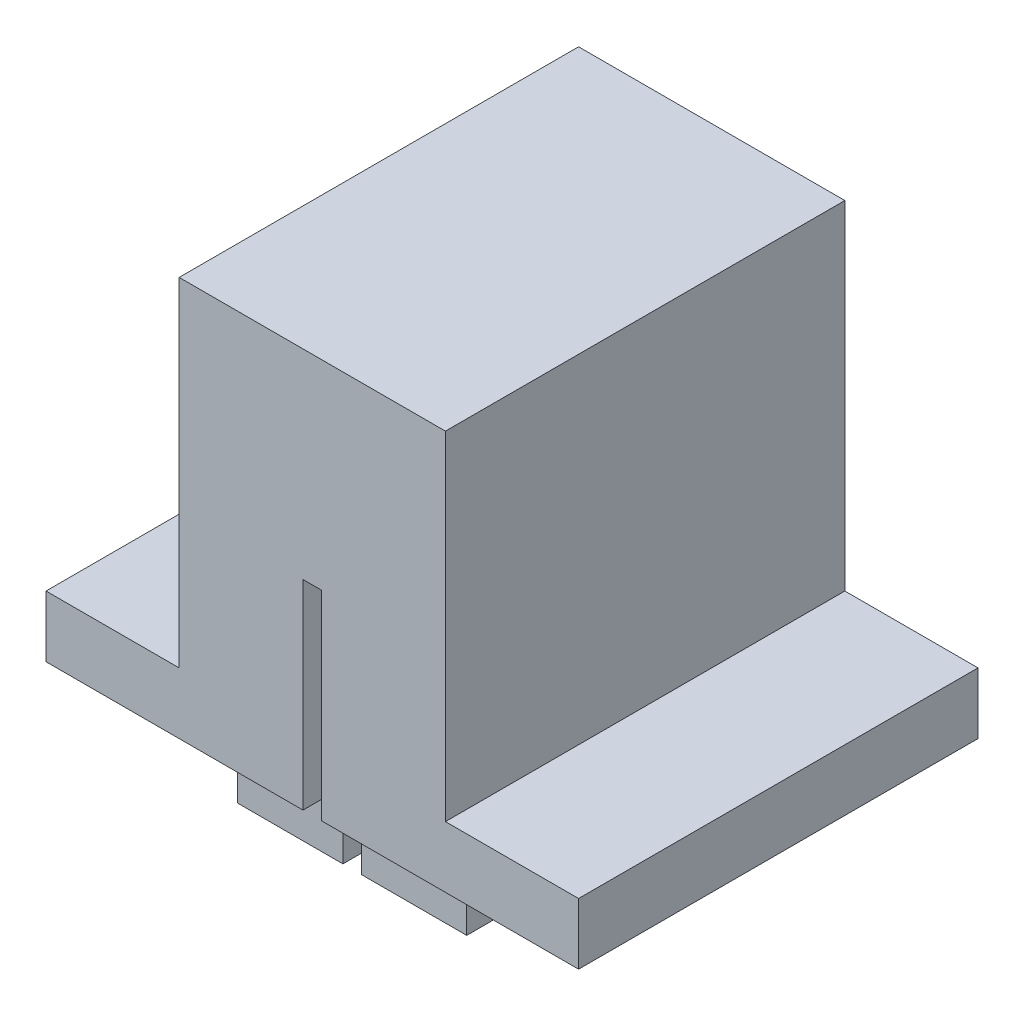
ISO-10303-21;
HEADER;
FILE_DESCRIPTION(('STEP AP214'),'2;1');
FILE_NAME('part.step','',(''),(''),'','','');
FILE_SCHEMA(('AUTOMOTIVE_DESIGN { 1 0 10303 214 1 1 1 1 }'));
ENDSEC;
DATA;
#1=APPLICATION_CONTEXT('core data for automotive mechanical design processes');
#2=APPLICATION_PROTOCOL_DEFINITION('international standard','automotive_design',2000,#1);
#3=PRODUCT_CONTEXT('',#1,'mechanical');
#4=PRODUCT('Part','Part','',(#3));
#5=PRODUCT_RELATED_PRODUCT_CATEGORY('part','',(#4));
#6=PRODUCT_DEFINITION_FORMATION('','',#4);
#7=PRODUCT_DEFINITION_CONTEXT('part definition',#1,'design');
#8=PRODUCT_DEFINITION('design','',#6,#7);
#9=PRODUCT_DEFINITION_SHAPE('','',#8);
#10=(LENGTH_UNIT() NAMED_UNIT(*) SI_UNIT(.MILLI.,.METRE.));
#11=(NAMED_UNIT(*) PLANE_ANGLE_UNIT() SI_UNIT($,.RADIAN.));
#12=(NAMED_UNIT(*) SI_UNIT($,.STERADIAN.) SOLID_ANGLE_UNIT());
#13=UNCERTAINTY_MEASURE_WITH_UNIT(LENGTH_MEASURE(1.E-05),#10,'distance_accuracy_value','');
#14=(GEOMETRIC_REPRESENTATION_CONTEXT(3) GLOBAL_UNCERTAINTY_ASSIGNED_CONTEXT((#13)) GLOBAL_UNIT_ASSIGNED_CONTEXT((#10,
#11,#12)) REPRESENTATION_CONTEXT('',''));
#15=CARTESIAN_POINT('',(0.,0.,0.));
#16=DIRECTION('',(0.,0.,1.));
#17=DIRECTION('',(1.,0.,0.));
#18=AXIS2_PLACEMENT_3D('',#15,#16,#17);
#19=CARTESIAN_POINT('',(5.,7.5,15.));
#20=DIRECTION('',(-1.,0.,0.));
#21=DIRECTION('',(0.,0.,1.));
#22=AXIS2_PLACEMENT_3D('',#19,#20,#21);
#23=PLANE('',#22);
#24=DIRECTION('',(0.,0.,1.));
#25=VECTOR('',#24,1.);
#26=CARTESIAN_POINT('',(5.,-2.7,-10.3077640640442));
#27=LINE('',#26,#25);
#28=CARTESIAN_POINT('',(5.,-2.7,0.));
#29=VERTEX_POINT('',#28);
#30=CARTESIAN_POINT('',(5.,-2.7,15.));
#31=VERTEX_POINT('',#30);
#32=EDGE_CURVE('E235',#29,#31,#27,.T.);
#33=ORIENTED_EDGE('',*,*,#32,.F.);
#34=DIRECTION('',(0.,1.,0.));
#35=VECTOR('',#34,1.);
#36=CARTESIAN_POINT('',(5.,7.5,0.));
#37=LINE('',#36,#35);
#38=CARTESIAN_POINT('',(5.,10.,0.));
#39=VERTEX_POINT('',#38);
#40=EDGE_CURVE('E308',#29,#39,#37,.T.);
#41=ORIENTED_EDGE('',*,*,#40,.T.);
#42=DIRECTION('',(0.,0.,1.));
#43=VECTOR('',#42,1.);
#44=CARTESIAN_POINT('',(5.,10.,-10.3077640640442));
#45=LINE('',#44,#43);
#46=CARTESIAN_POINT('',(5.,10.,15.));
#47=VERTEX_POINT('',#46);
#48=EDGE_CURVE('E249',#39,#47,#45,.T.);
#49=ORIENTED_EDGE('',*,*,#48,.T.);
#50=DIRECTION('',(0.,1.,0.));
#51=VECTOR('',#50,1.);
#52=CARTESIAN_POINT('',(5.,7.5,15.));
#53=LINE('',#52,#51);
#54=EDGE_CURVE('E309',#31,#47,#53,.T.);
#55=ORIENTED_EDGE('',*,*,#54,.F.);
#56=EDGE_LOOP('',(#33,#41,#49,#55));
#57=FACE_BOUND('',#56,.T.);
#58=ADVANCED_FACE('F39',(#57),#23,.F.);
#59=CARTESIAN_POINT('',(-5.,-7.5,15.));
#60=DIRECTION('',(0.,1.,0.));
#61=DIRECTION('',(0.,0.,1.));
#62=AXIS2_PLACEMENT_3D('',#59,#60,#61);
#63=PLANE('',#62);
#64=DIRECTION('',(-1.,0.,0.));
#65=VECTOR('',#64,1.);
#66=CARTESIAN_POINT('',(10.,-7.5,13.5));
#67=LINE('',#66,#65);
#68=CARTESIAN_POINT('',(-0.35,-7.5,13.5));
#69=VERTEX_POINT('',#68);
#70=CARTESIAN_POINT('',(-4.3,-7.5,13.5));
#71=VERTEX_POINT('',#70);
#72=EDGE_CURVE('E199',#69,#71,#67,.T.);
#73=ORIENTED_EDGE('',*,*,#72,.T.);
#74=DIRECTION('',(0.,0.,-1.));
#75=VECTOR('',#74,1.);
#76=CARTESIAN_POINT('',(-4.3,-7.5,15.));
#77=LINE('',#76,#75);
#78=CARTESIAN_POINT('',(-4.3,-7.5,1.5));
#79=VERTEX_POINT('',#78);
#80=EDGE_CURVE('E179',#71,#79,#77,.T.);
#81=ORIENTED_EDGE('',*,*,#80,.T.);
#82=DIRECTION('',(-1.,0.,0.));
#83=VECTOR('',#82,1.);
#84=CARTESIAN_POINT('',(10.,-7.5,1.5));
#85=LINE('',#84,#83);
#86=CARTESIAN_POINT('',(-0.35,-7.5,1.5));
#87=VERTEX_POINT('',#86);
#88=EDGE_CURVE('E198',#87,#79,#85,.T.);
#89=ORIENTED_EDGE('',*,*,#88,.F.);
#90=DIRECTION('',(0.,0.,1.));
#91=VECTOR('',#90,1.);
#92=CARTESIAN_POINT('',(-0.35,-7.5,0.));
#93=LINE('',#92,#91);
#94=EDGE_CURVE('E289',#87,#69,#93,.T.);
#95=ORIENTED_EDGE('',*,*,#94,.T.);
#96=EDGE_LOOP('',(#73,#81,#89,#95));
#97=FACE_BOUND('',#96,.T.);
#98=ADVANCED_FACE('F320',(#97),#63,.F.);
#99=CARTESIAN_POINT('',(-5.,7.5,15.));
#100=DIRECTION('',(1.,0.,0.));
#101=DIRECTION('',(0.,0.,-1.));
#102=AXIS2_PLACEMENT_3D('',#99,#100,#101);
#103=PLANE('',#102);
#104=DIRECTION('',(0.,-1.,0.));
#105=VECTOR('',#104,1.);
#106=CARTESIAN_POINT('',(-5.,7.5,0.));
#107=LINE('',#106,#105);
#108=CARTESIAN_POINT('',(-5.,10.,0.));
#109=VERTEX_POINT('',#108);
#110=CARTESIAN_POINT('',(-5.,-2.7,0.));
#111=VERTEX_POINT('',#110);
#112=EDGE_CURVE('E312',#109,#111,#107,.T.);
#113=ORIENTED_EDGE('',*,*,#112,.T.);
#114=DIRECTION('',(0.,0.,1.));
#115=VECTOR('',#114,1.);
#116=CARTESIAN_POINT('',(-5.,-2.7,-10.3077640640442));
#117=LINE('',#116,#115);
#118=CARTESIAN_POINT('',(-5.,-2.7,15.));
#119=VERTEX_POINT('',#118);
#120=EDGE_CURVE('E274',#111,#119,#117,.T.);
#121=ORIENTED_EDGE('',*,*,#120,.T.);
#122=DIRECTION('',(0.,-1.,0.));
#123=VECTOR('',#122,1.);
#124=CARTESIAN_POINT('',(-5.,7.5,15.));
#125=LINE('',#124,#123);
#126=CARTESIAN_POINT('',(-5.,10.,15.));
#127=VERTEX_POINT('',#126);
#128=EDGE_CURVE('E311',#127,#119,#125,.T.);
#129=ORIENTED_EDGE('',*,*,#128,.F.);
#130=DIRECTION('',(0.,0.,1.));
#131=VECTOR('',#130,1.);
#132=CARTESIAN_POINT('',(-5.,10.,-10.3077640640442));
#133=LINE('',#132,#131);
#134=EDGE_CURVE('E253',#109,#127,#133,.T.);
#135=ORIENTED_EDGE('',*,*,#134,.F.);
#136=EDGE_LOOP('',(#113,#121,#129,#135));
#137=FACE_BOUND('',#136,.T.);
#138=ADVANCED_FACE('F382',(#137),#103,.F.);
#139=CARTESIAN_POINT('',(4.3,-7.5,1.5));
#140=VERTEX_POINT('',#139);
#141=CARTESIAN_POINT('',(0.35,-7.5,1.5));
#142=VERTEX_POINT('',#141);
#143=EDGE_CURVE('E329',#140,#142,#85,.T.);
#144=ORIENTED_EDGE('',*,*,#143,.F.);
#145=DIRECTION('',(0.,0.,-1.));
#146=VECTOR('',#145,1.);
#147=CARTESIAN_POINT('',(4.3,-7.5,15.));
#148=LINE('',#147,#146);
#149=CARTESIAN_POINT('',(4.3,-7.5,13.5));
#150=VERTEX_POINT('',#149);
#151=EDGE_CURVE('E53',#150,#140,#148,.T.);
#152=ORIENTED_EDGE('',*,*,#151,.F.);
#153=CARTESIAN_POINT('',(0.35,-7.5,13.5));
#154=VERTEX_POINT('',#153);
#155=EDGE_CURVE('E196',#150,#154,#67,.T.);
#156=ORIENTED_EDGE('',*,*,#155,.T.);
#157=DIRECTION('',(0.,0.,1.));
#158=VECTOR('',#157,1.);
#159=CARTESIAN_POINT('',(0.35,-7.5,0.));
#160=LINE('',#159,#158);
#161=EDGE_CURVE('E297',#142,#154,#160,.T.);
#162=ORIENTED_EDGE('',*,*,#161,.F.);
#163=EDGE_LOOP('',(#144,#152,#156,#162));
#164=FACE_BOUND('',#163,.T.);
#165=ADVANCED_FACE('F341',(#164),#63,.F.);
#166=CARTESIAN_POINT('',(0.,0.,15.));
#167=DIRECTION('',(0.,0.,1.));
#168=DIRECTION('',(1.,0.,0.));
#169=AXIS2_PLACEMENT_3D('',#166,#167,#168);
#170=PLANE('',#169);
#171=DIRECTION('',(0.,1.,0.));
#172=VECTOR('',#171,1.);
#173=CARTESIAN_POINT('',(0.35,0.,15.));
#174=LINE('',#173,#172);
#175=CARTESIAN_POINT('',(0.35,-5.,15.));
#176=VERTEX_POINT('',#175);
#177=CARTESIAN_POINT('',(0.35,2.5,15.));
#178=VERTEX_POINT('',#177);
#179=EDGE_CURVE('E293',#176,#178,#174,.T.);
#180=ORIENTED_EDGE('',*,*,#179,.F.);
#181=DIRECTION('',(1.,0.,0.));
#182=VECTOR('',#181,1.);
#183=CARTESIAN_POINT('',(5.,-5.,15.));
#184=LINE('',#183,#182);
#185=CARTESIAN_POINT('',(10.,-5.,15.));
#186=VERTEX_POINT('',#185);
#187=EDGE_CURVE('E244',#176,#186,#184,.T.);
#188=ORIENTED_EDGE('',*,*,#187,.T.);
#189=DIRECTION('',(0.,1.,0.));
#190=VECTOR('',#189,1.);
#191=CARTESIAN_POINT('',(10.,-2.7,15.));
#192=LINE('',#191,#190);
#193=CARTESIAN_POINT('',(10.,-2.7,15.));
#194=VERTEX_POINT('',#193);
#195=EDGE_CURVE('E241',#186,#194,#192,.T.);
#196=ORIENTED_EDGE('',*,*,#195,.T.);
#197=DIRECTION('',(-1.,0.,0.));
#198=VECTOR('',#197,1.);
#199=CARTESIAN_POINT('',(5.,-2.7,15.));
#200=LINE('',#199,#198);
#201=EDGE_CURVE('E232',#194,#31,#200,.T.);
#202=ORIENTED_EDGE('',*,*,#201,.T.);
#203=ORIENTED_EDGE('',*,*,#54,.T.);
#204=DIRECTION('',(-1.,0.,0.));
#205=VECTOR('',#204,1.);
#206=CARTESIAN_POINT('',(-5.,10.,15.));
#207=LINE('',#206,#205);
#208=EDGE_CURVE('E252',#47,#127,#207,.T.);
#209=ORIENTED_EDGE('',*,*,#208,.T.);
#210=ORIENTED_EDGE('',*,*,#128,.T.);
#211=DIRECTION('',(-1.,0.,0.));
#212=VECTOR('',#211,1.);
#213=CARTESIAN_POINT('',(-5.,-2.7,15.));
#214=LINE('',#213,#212);
#215=CARTESIAN_POINT('',(-10.,-2.7,15.));
#216=VERTEX_POINT('',#215);
#217=EDGE_CURVE('E258',#119,#216,#214,.T.);
#218=ORIENTED_EDGE('',*,*,#217,.T.);
#219=DIRECTION('',(0.,-1.,0.));
#220=VECTOR('',#219,1.);
#221=CARTESIAN_POINT('',(-10.,-2.7,15.));
#222=LINE('',#221,#220);
#223=CARTESIAN_POINT('',(-10.,-5.,15.));
#224=VERTEX_POINT('',#223);
#225=EDGE_CURVE('E269',#216,#224,#222,.T.);
#226=ORIENTED_EDGE('',*,*,#225,.T.);
#227=DIRECTION('',(1.,0.,0.));
#228=VECTOR('',#227,1.);
#229=CARTESIAN_POINT('',(-5.,-5.,15.));
#230=LINE('',#229,#228);
#231=CARTESIAN_POINT('',(-0.35,-5.,15.));
#232=VERTEX_POINT('',#231);
#233=EDGE_CURVE('E272',#224,#232,#230,.T.);
#234=ORIENTED_EDGE('',*,*,#233,.T.);
#235=DIRECTION('',(0.,-1.,0.));
#236=VECTOR('',#235,1.);
#237=CARTESIAN_POINT('',(-0.35,0.,15.));
#238=LINE('',#237,#236);
#239=CARTESIAN_POINT('',(-0.35,2.5,15.));
#240=VERTEX_POINT('',#239);
#241=EDGE_CURVE('E305',#240,#232,#238,.T.);
#242=ORIENTED_EDGE('',*,*,#241,.F.);
#243=DIRECTION('',(-1.,0.,0.));
#244=VECTOR('',#243,1.);
#245=CARTESIAN_POINT('',(0.,2.5,15.));
#246=LINE('',#245,#244);
#247=EDGE_CURVE('E303',#178,#240,#246,.T.);
#248=ORIENTED_EDGE('',*,*,#247,.F.);
#249=EDGE_LOOP('',(#180,#188,#196,#202,#203,#209,#210,#218,#226,#234,#242,#248));
#250=FACE_BOUND('',#249,.T.);
#251=ADVANCED_FACE('F353',(#250),#170,.T.);
#252=CARTESIAN_POINT('',(0.,0.,0.));
#253=DIRECTION('',(0.,0.,1.));
#254=DIRECTION('',(1.,0.,0.));
#255=AXIS2_PLACEMENT_3D('',#252,#253,#254);
#256=PLANE('',#255);
#257=DIRECTION('',(-1.,0.,0.));
#258=VECTOR('',#257,1.);
#259=CARTESIAN_POINT('',(5.,-5.,0.));
#260=LINE('',#259,#258);
#261=CARTESIAN_POINT('',(10.,-5.,0.));
#262=VERTEX_POINT('',#261);
#263=CARTESIAN_POINT('',(0.35,-5.,0.));
#264=VERTEX_POINT('',#263);
#265=EDGE_CURVE('E226',#262,#264,#260,.T.);
#266=ORIENTED_EDGE('',*,*,#265,.T.);
#267=DIRECTION('',(0.,1.,0.));
#268=VECTOR('',#267,1.);
#269=CARTESIAN_POINT('',(0.35,-7.5,0.));
#270=LINE('',#269,#268);
#271=CARTESIAN_POINT('',(0.35,2.5,0.));
#272=VERTEX_POINT('',#271);
#273=EDGE_CURVE('E284',#264,#272,#270,.T.);
#274=ORIENTED_EDGE('',*,*,#273,.T.);
#275=DIRECTION('',(-1.,0.,0.));
#276=VECTOR('',#275,1.);
#277=CARTESIAN_POINT('',(-0.35,2.5,0.));
#278=LINE('',#277,#276);
#279=CARTESIAN_POINT('',(-0.35,2.5,0.));
#280=VERTEX_POINT('',#279);
#281=EDGE_CURVE('E286',#272,#280,#278,.T.);
#282=ORIENTED_EDGE('',*,*,#281,.T.);
#283=DIRECTION('',(0.,-1.,0.));
#284=VECTOR('',#283,1.);
#285=CARTESIAN_POINT('',(-0.35,-7.5,0.));
#286=LINE('',#285,#284);
#287=CARTESIAN_POINT('',(-0.35,-5.,0.));
#288=VERTEX_POINT('',#287);
#289=EDGE_CURVE('E281',#280,#288,#286,.T.);
#290=ORIENTED_EDGE('',*,*,#289,.T.);
#291=DIRECTION('',(-1.,0.,0.));
#292=VECTOR('',#291,1.);
#293=CARTESIAN_POINT('',(-5.,-5.,0.));
#294=LINE('',#293,#292);
#295=CARTESIAN_POINT('',(-10.,-5.,0.));
#296=VERTEX_POINT('',#295);
#297=EDGE_CURVE('E263',#288,#296,#294,.T.);
#298=ORIENTED_EDGE('',*,*,#297,.T.);
#299=DIRECTION('',(0.,1.,0.));
#300=VECTOR('',#299,1.);
#301=CARTESIAN_POINT('',(-10.,-2.7,0.));
#302=LINE('',#301,#300);
#303=CARTESIAN_POINT('',(-10.,-2.7,0.));
#304=VERTEX_POINT('',#303);
#305=EDGE_CURVE('E261',#296,#304,#302,.T.);
#306=ORIENTED_EDGE('',*,*,#305,.T.);
#307=DIRECTION('',(1.,0.,0.));
#308=VECTOR('',#307,1.);
#309=CARTESIAN_POINT('',(-5.,-2.7,0.));
#310=LINE('',#309,#308);
#311=EDGE_CURVE('E266',#304,#111,#310,.T.);
#312=ORIENTED_EDGE('',*,*,#311,.T.);
#313=ORIENTED_EDGE('',*,*,#112,.F.);
#314=DIRECTION('',(1.,0.,0.));
#315=VECTOR('',#314,1.);
#316=CARTESIAN_POINT('',(-5.,10.,0.));
#317=LINE('',#316,#315);
#318=EDGE_CURVE('E246',#109,#39,#317,.T.);
#319=ORIENTED_EDGE('',*,*,#318,.T.);
#320=ORIENTED_EDGE('',*,*,#40,.F.);
#321=DIRECTION('',(1.,0.,0.));
#322=VECTOR('',#321,1.);
#323=CARTESIAN_POINT('',(5.,-2.7,0.));
#324=LINE('',#323,#322);
#325=CARTESIAN_POINT('',(10.,-2.7,0.));
#326=VERTEX_POINT('',#325);
#327=EDGE_CURVE('E228',#29,#326,#324,.T.);
#328=ORIENTED_EDGE('',*,*,#327,.T.);
#329=DIRECTION('',(0.,-1.,0.));
#330=VECTOR('',#329,1.);
#331=CARTESIAN_POINT('',(10.,-2.7,0.));
#332=LINE('',#331,#330);
#333=EDGE_CURVE('E238',#326,#262,#332,.T.);
#334=ORIENTED_EDGE('',*,*,#333,.T.);
#335=EDGE_LOOP('',(#266,#274,#282,#290,#298,#306,#312,#313,#319,#320,#328,#334));
#336=FACE_BOUND('',#335,.T.);
#337=ADVANCED_FACE('F362',(#336),#256,.F.);
#338=CARTESIAN_POINT('',(-0.35,-7.5,0.));
#339=DIRECTION('',(-1.,0.,0.));
#340=DIRECTION('',(0.,0.,1.));
#341=AXIS2_PLACEMENT_3D('',#338,#339,#340);
#342=PLANE('',#341);
#343=DIRECTION('',(0.,1.,0.));
#344=VECTOR('',#343,1.);
#345=CARTESIAN_POINT('',(-0.35,-7.5,1.5));
#346=LINE('',#345,#344);
#347=CARTESIAN_POINT('',(-0.35,-5.,1.5));
#348=VERTEX_POINT('',#347);
#349=EDGE_CURVE('E212',#87,#348,#346,.T.);
#350=ORIENTED_EDGE('',*,*,#349,.T.);
#351=DIRECTION('',(0.,0.,-1.));
#352=VECTOR('',#351,1.);
#353=CARTESIAN_POINT('',(-0.35,-5.,0.));
#354=LINE('',#353,#352);
#355=EDGE_CURVE('E223',#348,#288,#354,.T.);
#356=ORIENTED_EDGE('',*,*,#355,.T.);
#357=ORIENTED_EDGE('',*,*,#289,.F.);
#358=DIRECTION('',(0.,0.,1.));
#359=VECTOR('',#358,1.);
#360=CARTESIAN_POINT('',(-0.35,2.5,0.));
#361=LINE('',#360,#359);
#362=EDGE_CURVE('E290',#280,#240,#361,.T.);
#363=ORIENTED_EDGE('',*,*,#362,.T.);
#364=ORIENTED_EDGE('',*,*,#241,.T.);
#365=DIRECTION('',(0.,0.,-1.));
#366=VECTOR('',#365,1.);
#367=CARTESIAN_POINT('',(-0.35,-5.,0.));
#368=LINE('',#367,#366);
#369=CARTESIAN_POINT('',(-0.35,-5.,13.5));
#370=VERTEX_POINT('',#369);
#371=EDGE_CURVE('E218',#232,#370,#368,.T.);
#372=ORIENTED_EDGE('',*,*,#371,.T.);
#373=DIRECTION('',(0.,-1.,0.));
#374=VECTOR('',#373,1.);
#375=CARTESIAN_POINT('',(-0.35,-7.49999999999999,13.5));
#376=LINE('',#375,#374);
#377=EDGE_CURVE('E193',#370,#69,#376,.T.);
#378=ORIENTED_EDGE('',*,*,#377,.T.);
#379=ORIENTED_EDGE('',*,*,#94,.F.);
#380=EDGE_LOOP('',(#350,#356,#357,#363,#364,#372,#378,#379));
#381=FACE_BOUND('',#380,.T.);
#382=ADVANCED_FACE('F360',(#381),#342,.F.);
#383=CARTESIAN_POINT('',(-0.35,2.5,0.));
#384=DIRECTION('',(0.,1.,0.));
#385=DIRECTION('',(0.,0.,1.));
#386=AXIS2_PLACEMENT_3D('',#383,#384,#385);
#387=PLANE('',#386);
#388=ORIENTED_EDGE('',*,*,#247,.T.);
#389=ORIENTED_EDGE('',*,*,#362,.F.);
#390=ORIENTED_EDGE('',*,*,#281,.F.);
#391=DIRECTION('',(0.,0.,1.));
#392=VECTOR('',#391,1.);
#393=CARTESIAN_POINT('',(0.35,2.5,0.));
#394=LINE('',#393,#392);
#395=EDGE_CURVE('E294',#272,#178,#394,.T.);
#396=ORIENTED_EDGE('',*,*,#395,.T.);
#397=EDGE_LOOP('',(#388,#389,#390,#396));
#398=FACE_BOUND('',#397,.T.);
#399=ADVANCED_FACE('F356',(#398),#387,.F.);
#400=CARTESIAN_POINT('',(0.35,-7.5,0.));
#401=DIRECTION('',(1.,0.,0.));
#402=DIRECTION('',(0.,1.,0.));
#403=AXIS2_PLACEMENT_3D('',#400,#401,#402);
#404=PLANE('',#403);
#405=ORIENTED_EDGE('',*,*,#273,.F.);
#406=DIRECTION('',(0.,0.,1.));
#407=VECTOR('',#406,1.);
#408=CARTESIAN_POINT('',(0.35,-5.,0.));
#409=LINE('',#408,#407);
#410=CARTESIAN_POINT('',(0.35,-5.,1.5));
#411=VERTEX_POINT('',#410);
#412=EDGE_CURVE('E220',#264,#411,#409,.T.);
#413=ORIENTED_EDGE('',*,*,#412,.T.);
#414=DIRECTION('',(0.,-1.,0.));
#415=VECTOR('',#414,1.);
#416=CARTESIAN_POINT('',(0.35,-7.5,1.5));
#417=LINE('',#416,#415);
#418=EDGE_CURVE('E209',#411,#142,#417,.T.);
#419=ORIENTED_EDGE('',*,*,#418,.T.);
#420=ORIENTED_EDGE('',*,*,#161,.T.);
#421=DIRECTION('',(0.,1.,0.));
#422=VECTOR('',#421,1.);
#423=CARTESIAN_POINT('',(0.35,-7.49999999999999,13.5));
#424=LINE('',#423,#422);
#425=CARTESIAN_POINT('',(0.35,-5.,13.5));
#426=VERTEX_POINT('',#425);
#427=EDGE_CURVE('E204',#154,#426,#424,.T.);
#428=ORIENTED_EDGE('',*,*,#427,.T.);
#429=DIRECTION('',(0.,0.,1.));
#430=VECTOR('',#429,1.);
#431=CARTESIAN_POINT('',(0.35,-5.,0.));
#432=LINE('',#431,#430);
#433=EDGE_CURVE('E215',#426,#176,#432,.T.);
#434=ORIENTED_EDGE('',*,*,#433,.T.);
#435=ORIENTED_EDGE('',*,*,#179,.T.);
#436=ORIENTED_EDGE('',*,*,#395,.F.);
#437=EDGE_LOOP('',(#405,#413,#419,#420,#428,#434,#435,#436));
#438=FACE_BOUND('',#437,.T.);
#439=ADVANCED_FACE('F339',(#438),#404,.F.);
#440=CARTESIAN_POINT('',(-5.,-5.,-10.3077640640442));
#441=DIRECTION('',(0.,-1.,0.));
#442=DIRECTION('',(1.,0.,0.));
#443=AXIS2_PLACEMENT_3D('',#440,#441,#442);
#444=PLANE('',#443);
#445=ORIENTED_EDGE('',*,*,#371,.F.);
#446=ORIENTED_EDGE('',*,*,#233,.F.);
#447=DIRECTION('',(0.,0.,1.));
#448=VECTOR('',#447,1.);
#449=CARTESIAN_POINT('',(-10.,-5.,-10.3077640640442));
#450=LINE('',#449,#448);
#451=EDGE_CURVE('E264',#296,#224,#450,.T.);
#452=ORIENTED_EDGE('',*,*,#451,.F.);
#453=ORIENTED_EDGE('',*,*,#297,.F.);
#454=ORIENTED_EDGE('',*,*,#355,.F.);
#455=DIRECTION('',(-1.,0.,0.));
#456=VECTOR('',#455,1.);
#457=CARTESIAN_POINT('',(10.,-5.,1.5));
#458=LINE('',#457,#456);
#459=CARTESIAN_POINT('',(-4.3,-5.,1.5));
#460=VERTEX_POINT('',#459);
#461=EDGE_CURVE('E60',#348,#460,#458,.T.);
#462=ORIENTED_EDGE('',*,*,#461,.T.);
#463=DIRECTION('',(0.,0.,-1.));
#464=VECTOR('',#463,1.);
#465=CARTESIAN_POINT('',(-4.3,-5.,15.));
#466=LINE('',#465,#464);
#467=CARTESIAN_POINT('',(-4.3,-5.,13.5));
#468=VERTEX_POINT('',#467);
#469=EDGE_CURVE('E177',#468,#460,#466,.T.);
#470=ORIENTED_EDGE('',*,*,#469,.F.);
#471=DIRECTION('',(-1.,0.,0.));
#472=VECTOR('',#471,1.);
#473=CARTESIAN_POINT('',(10.,-5.,13.5));
#474=LINE('',#473,#472);
#475=EDGE_CURVE('E188',#370,#468,#474,.T.);
#476=ORIENTED_EDGE('',*,*,#475,.F.);
#477=EDGE_LOOP('',(#445,#446,#452,#453,#454,#462,#470,#476));
#478=FACE_BOUND('',#477,.T.);
#479=ADVANCED_FACE('F187',(#478),#444,.T.);
#480=CARTESIAN_POINT('',(-10.,-2.7,-10.3077640640442));
#481=DIRECTION('',(-1.,0.,0.));
#482=DIRECTION('',(0.,-1.,0.));
#483=AXIS2_PLACEMENT_3D('',#480,#481,#482);
#484=PLANE('',#483);
#485=ORIENTED_EDGE('',*,*,#305,.F.);
#486=ORIENTED_EDGE('',*,*,#451,.T.);
#487=ORIENTED_EDGE('',*,*,#225,.F.);
#488=DIRECTION('',(0.,0.,1.));
#489=VECTOR('',#488,1.);
#490=CARTESIAN_POINT('',(-10.,-2.7,-10.3077640640442));
#491=LINE('',#490,#489);
#492=EDGE_CURVE('E276',#304,#216,#491,.T.);
#493=ORIENTED_EDGE('',*,*,#492,.F.);
#494=EDGE_LOOP('',(#485,#486,#487,#493));
#495=FACE_BOUND('',#494,.T.);
#496=ADVANCED_FACE('F409',(#495),#484,.T.);
#497=CARTESIAN_POINT('',(-5.,-2.7,-10.3077640640442));
#498=DIRECTION('',(0.,1.,0.));
#499=DIRECTION('',(-1.,0.,0.));
#500=AXIS2_PLACEMENT_3D('',#497,#498,#499);
#501=PLANE('',#500);
#502=ORIENTED_EDGE('',*,*,#311,.F.);
#503=ORIENTED_EDGE('',*,*,#492,.T.);
#504=ORIENTED_EDGE('',*,*,#217,.F.);
#505=ORIENTED_EDGE('',*,*,#120,.F.);
#506=EDGE_LOOP('',(#502,#503,#504,#505));
#507=FACE_BOUND('',#506,.T.);
#508=ADVANCED_FACE('F404',(#507),#501,.T.);
#509=CARTESIAN_POINT('',(-5.,10.,-10.3077640640442));
#510=DIRECTION('',(0.,1.,0.));
#511=DIRECTION('',(0.,0.,1.));
#512=AXIS2_PLACEMENT_3D('',#509,#510,#511);
#513=PLANE('',#512);
#514=ORIENTED_EDGE('',*,*,#318,.F.);
#515=ORIENTED_EDGE('',*,*,#134,.T.);
#516=ORIENTED_EDGE('',*,*,#208,.F.);
#517=ORIENTED_EDGE('',*,*,#48,.F.);
#518=EDGE_LOOP('',(#514,#515,#516,#517));
#519=FACE_BOUND('',#518,.T.);
#520=ADVANCED_FACE('F397',(#519),#513,.T.);
#521=CARTESIAN_POINT('',(5.,-2.7,-10.3077640640442));
#522=DIRECTION('',(0.,1.,0.));
#523=DIRECTION('',(-1.,0.,0.));
#524=AXIS2_PLACEMENT_3D('',#521,#522,#523);
#525=PLANE('',#524);
#526=ORIENTED_EDGE('',*,*,#327,.F.);
#527=ORIENTED_EDGE('',*,*,#32,.T.);
#528=ORIENTED_EDGE('',*,*,#201,.F.);
#529=DIRECTION('',(0.,0.,1.));
#530=VECTOR('',#529,1.);
#531=CARTESIAN_POINT('',(10.,-2.7,-10.3077640640442));
#532=LINE('',#531,#530);
#533=EDGE_CURVE('E233',#326,#194,#532,.T.);
#534=ORIENTED_EDGE('',*,*,#533,.F.);
#535=EDGE_LOOP('',(#526,#527,#528,#534));
#536=FACE_BOUND('',#535,.T.);
#537=ADVANCED_FACE('F391',(#536),#525,.T.);
#538=CARTESIAN_POINT('',(10.,-2.7,-10.3077640640442));
#539=DIRECTION('',(1.,0.,0.));
#540=DIRECTION('',(0.,1.,0.));
#541=AXIS2_PLACEMENT_3D('',#538,#539,#540);
#542=PLANE('',#541);
#543=ORIENTED_EDGE('',*,*,#333,.F.);
#544=ORIENTED_EDGE('',*,*,#533,.T.);
#545=ORIENTED_EDGE('',*,*,#195,.F.);
#546=DIRECTION('',(0.,0.,1.));
#547=VECTOR('',#546,1.);
#548=CARTESIAN_POINT('',(10.,-5.,-10.3077640640442));
#549=LINE('',#548,#547);
#550=EDGE_CURVE('E229',#262,#186,#549,.T.);
#551=ORIENTED_EDGE('',*,*,#550,.F.);
#552=EDGE_LOOP('',(#543,#544,#545,#551));
#553=FACE_BOUND('',#552,.T.);
#554=ADVANCED_FACE('F394',(#553),#542,.T.);
#555=CARTESIAN_POINT('',(5.,-5.,-10.3077640640442));
#556=DIRECTION('',(0.,-1.,0.));
#557=DIRECTION('',(1.,0.,0.));
#558=AXIS2_PLACEMENT_3D('',#555,#556,#557);
#559=PLANE('',#558);
#560=ORIENTED_EDGE('',*,*,#412,.F.);
#561=ORIENTED_EDGE('',*,*,#265,.F.);
#562=ORIENTED_EDGE('',*,*,#550,.T.);
#563=ORIENTED_EDGE('',*,*,#187,.F.);
#564=ORIENTED_EDGE('',*,*,#433,.F.);
#565=CARTESIAN_POINT('',(4.3,-5.,13.5));
#566=VERTEX_POINT('',#565);
#567=EDGE_CURVE('E195',#566,#426,#474,.T.);
#568=ORIENTED_EDGE('',*,*,#567,.F.);
#569=DIRECTION('',(0.,0.,-1.));
#570=VECTOR('',#569,1.);
#571=CARTESIAN_POINT('',(4.3,-5.,15.));
#572=LINE('',#571,#570);
#573=CARTESIAN_POINT('',(4.3,-5.,1.5));
#574=VERTEX_POINT('',#573);
#575=EDGE_CURVE('E325',#566,#574,#572,.T.);
#576=ORIENTED_EDGE('',*,*,#575,.T.);
#577=EDGE_CURVE('E207',#574,#411,#458,.T.);
#578=ORIENTED_EDGE('',*,*,#577,.T.);
#579=EDGE_LOOP('',(#560,#561,#562,#563,#564,#568,#576,#578));
#580=FACE_BOUND('',#579,.T.);
#581=ADVANCED_FACE('F366',(#580),#559,.T.);
#582=CARTESIAN_POINT('',(10.,-5.,13.5));
#583=DIRECTION('',(0.,0.,-1.));
#584=DIRECTION('',(0.,1.,0.));
#585=AXIS2_PLACEMENT_3D('',#582,#583,#584);
#586=PLANE('',#585);
#587=ORIENTED_EDGE('',*,*,#155,.F.);
#588=DIRECTION('',(0.,1.,0.));
#589=VECTOR('',#588,1.);
#590=CARTESIAN_POINT('',(4.3,-5.,13.5));
#591=LINE('',#590,#589);
#592=EDGE_CURVE('E183',#150,#566,#591,.T.);
#593=ORIENTED_EDGE('',*,*,#592,.T.);
#594=ORIENTED_EDGE('',*,*,#567,.T.);
#595=ORIENTED_EDGE('',*,*,#427,.F.);
#596=EDGE_LOOP('',(#587,#593,#594,#595));
#597=FACE_BOUND('',#596,.T.);
#598=ADVANCED_FACE('F345',(#597),#586,.F.);
#599=CARTESIAN_POINT('',(10.,-7.5,1.5));
#600=DIRECTION('',(0.,0.,1.));
#601=DIRECTION('',(1.,0.,0.));
#602=AXIS2_PLACEMENT_3D('',#599,#600,#601);
#603=PLANE('',#602);
#604=ORIENTED_EDGE('',*,*,#577,.F.);
#605=DIRECTION('',(0.,-1.,0.));
#606=VECTOR('',#605,1.);
#607=CARTESIAN_POINT('',(4.3,-7.5,1.5));
#608=LINE('',#607,#606);
#609=EDGE_CURVE('E11',#574,#140,#608,.T.);
#610=ORIENTED_EDGE('',*,*,#609,.T.);
#611=ORIENTED_EDGE('',*,*,#143,.T.);
#612=ORIENTED_EDGE('',*,*,#418,.F.);
#613=EDGE_LOOP('',(#604,#610,#611,#612));
#614=FACE_BOUND('',#613,.T.);
#615=ADVANCED_FACE('F334',(#614),#603,.F.);
#616=ORIENTED_EDGE('',*,*,#475,.T.);
#617=DIRECTION('',(0.,-1.,0.));
#618=VECTOR('',#617,1.);
#619=CARTESIAN_POINT('',(-4.3,-5.,13.5));
#620=LINE('',#619,#618);
#621=EDGE_CURVE('E174',#468,#71,#620,.T.);
#622=ORIENTED_EDGE('',*,*,#621,.T.);
#623=ORIENTED_EDGE('',*,*,#72,.F.);
#624=ORIENTED_EDGE('',*,*,#377,.F.);
#625=EDGE_LOOP('',(#616,#622,#623,#624));
#626=FACE_BOUND('',#625,.T.);
#627=ADVANCED_FACE('F191',(#626),#586,.F.);
#628=ORIENTED_EDGE('',*,*,#88,.T.);
#629=DIRECTION('',(0.,1.,0.));
#630=VECTOR('',#629,1.);
#631=CARTESIAN_POINT('',(-4.3,-7.5,1.5));
#632=LINE('',#631,#630);
#633=EDGE_CURVE('E46',#79,#460,#632,.T.);
#634=ORIENTED_EDGE('',*,*,#633,.T.);
#635=ORIENTED_EDGE('',*,*,#461,.F.);
#636=ORIENTED_EDGE('',*,*,#349,.F.);
#637=EDGE_LOOP('',(#628,#634,#635,#636));
#638=FACE_BOUND('',#637,.T.);
#639=ADVANCED_FACE('F317',(#638),#603,.F.);
#640=CARTESIAN_POINT('',(-4.3,-7.5,15.));
#641=DIRECTION('',(1.,0.,0.));
#642=DIRECTION('',(0.,0.,-1.));
#643=AXIS2_PLACEMENT_3D('',#640,#641,#642);
#644=PLANE('',#643);
#645=ORIENTED_EDGE('',*,*,#469,.T.);
#646=ORIENTED_EDGE('',*,*,#633,.F.);
#647=ORIENTED_EDGE('',*,*,#80,.F.);
#648=ORIENTED_EDGE('',*,*,#621,.F.);
#649=EDGE_LOOP('',(#645,#646,#647,#648));
#650=FACE_BOUND('',#649,.T.);
#651=ADVANCED_FACE('F176',(#650),#644,.F.);
#652=CARTESIAN_POINT('',(4.3,-7.5,15.));
#653=DIRECTION('',(-1.,0.,0.));
#654=DIRECTION('',(0.,0.,1.));
#655=AXIS2_PLACEMENT_3D('',#652,#653,#654);
#656=PLANE('',#655);
#657=ORIENTED_EDGE('',*,*,#151,.T.);
#658=ORIENTED_EDGE('',*,*,#609,.F.);
#659=ORIENTED_EDGE('',*,*,#575,.F.);
#660=ORIENTED_EDGE('',*,*,#592,.F.);
#661=EDGE_LOOP('',(#657,#658,#659,#660));
#662=FACE_BOUND('',#661,.T.);
#663=ADVANCED_FACE('F367',(#662),#656,.F.);
#664=CLOSED_SHELL('',(#58,#98,#138,#165,#251,#337,#382,#399,#439,#479,#496,#508,#520,#537,#554,
#581,#598,#615,#627,#639,#651,#663));
#665=MANIFOLD_SOLID_BREP('B2',#664);
#666=ADVANCED_BREP_SHAPE_REPRESENTATION('',(#18,#665),#14);
#667=SHAPE_DEFINITION_REPRESENTATION(#9,#666);
ENDSEC;
END-ISO-10303-21;
